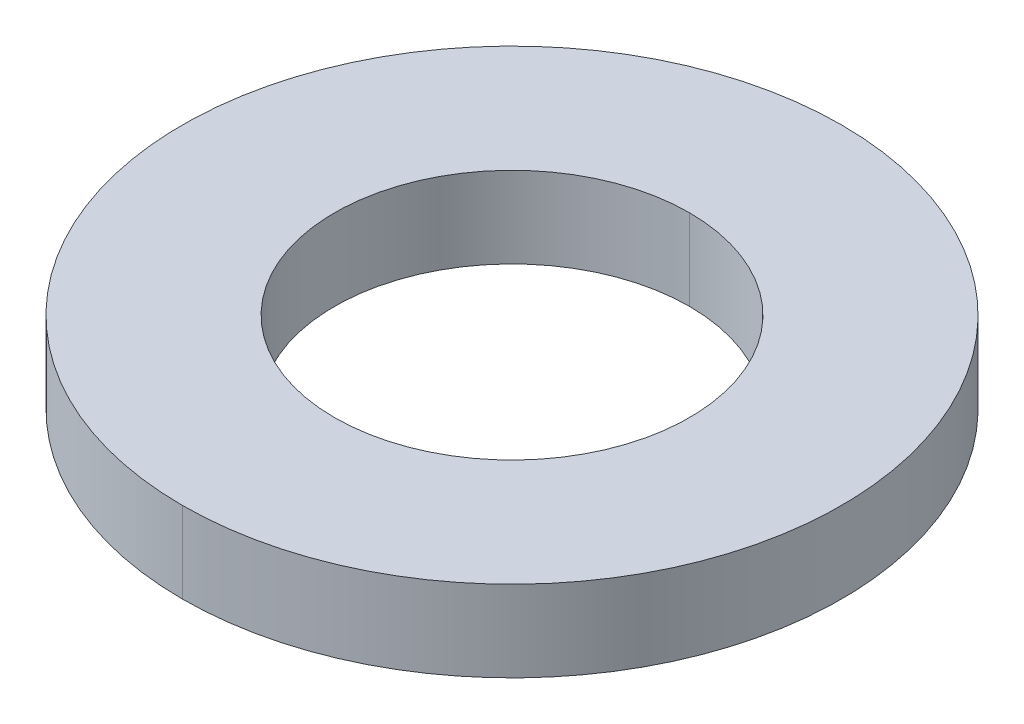
ISO-10303-21;
HEADER;
FILE_DESCRIPTION(('STEP AP214'),'2;1');
FILE_NAME('part.step','',(''),(''),'','','');
FILE_SCHEMA(('AUTOMOTIVE_DESIGN { 1 0 10303 214 1 1 1 1 }'));
ENDSEC;
DATA;
#1=APPLICATION_CONTEXT('core data for automotive mechanical design processes');
#2=APPLICATION_PROTOCOL_DEFINITION('international standard','automotive_design',2000,#1);
#3=PRODUCT_CONTEXT('',#1,'mechanical');
#4=PRODUCT('Part','Part','',(#3));
#5=PRODUCT_RELATED_PRODUCT_CATEGORY('part','',(#4));
#6=PRODUCT_DEFINITION_FORMATION('','',#4);
#7=PRODUCT_DEFINITION_CONTEXT('part definition',#1,'design');
#8=PRODUCT_DEFINITION('design','',#6,#7);
#9=PRODUCT_DEFINITION_SHAPE('','',#8);
#10=(LENGTH_UNIT() NAMED_UNIT(*) SI_UNIT(.MILLI.,.METRE.));
#11=(NAMED_UNIT(*) PLANE_ANGLE_UNIT() SI_UNIT($,.RADIAN.));
#12=(NAMED_UNIT(*) SI_UNIT($,.STERADIAN.) SOLID_ANGLE_UNIT());
#13=UNCERTAINTY_MEASURE_WITH_UNIT(LENGTH_MEASURE(1.E-05),#10,'distance_accuracy_value','');
#14=(GEOMETRIC_REPRESENTATION_CONTEXT(3) GLOBAL_UNCERTAINTY_ASSIGNED_CONTEXT((#13)) GLOBAL_UNIT_ASSIGNED_CONTEXT((#10,
#11,#12)) REPRESENTATION_CONTEXT('',''));
#15=CARTESIAN_POINT('',(0.,0.,0.));
#16=DIRECTION('',(0.,0.,1.));
#17=DIRECTION('',(1.,0.,0.));
#18=AXIS2_PLACEMENT_3D('',#15,#16,#17);
#19=CARTESIAN_POINT('',(0.,0.8,0.));
#20=DIRECTION('',(0.,-1.,0.));
#21=DIRECTION('',(0.,0.,-1.));
#22=AXIS2_PLACEMENT_3D('',#19,#20,#21);
#23=CYLINDRICAL_SURFACE('',#22,1.75);
#24=DIRECTION('',(0.,-1.,0.));
#25=VECTOR('',#24,1.);
#26=CARTESIAN_POINT('',(0.,0.8,1.75));
#27=LINE('',#26,#25);
#28=CARTESIAN_POINT('',(0.,0.8,1.75));
#29=VERTEX_POINT('',#28);
#30=CARTESIAN_POINT('',(0.,0.,1.75));
#31=VERTEX_POINT('',#30);
#32=EDGE_CURVE('E20',#29,#31,#27,.T.);
#33=ORIENTED_EDGE('',*,*,#32,.F.);
#34=CARTESIAN_POINT('',(0.,0.8,0.));
#35=DIRECTION('',(0.,1.,0.));
#36=DIRECTION('',(0.,0.,1.));
#37=AXIS2_PLACEMENT_3D('',#34,#35,#36);
#38=CIRCLE('',#37,1.75);
#39=CARTESIAN_POINT('',(0.,0.8,-1.75));
#40=VERTEX_POINT('',#39);
#41=EDGE_CURVE('E106',#29,#40,#38,.T.);
#42=ORIENTED_EDGE('',*,*,#41,.T.);
#43=DIRECTION('',(0.,-1.,0.));
#44=VECTOR('',#43,1.);
#45=CARTESIAN_POINT('',(0.,0.8,-1.75));
#46=LINE('',#45,#44);
#47=CARTESIAN_POINT('',(0.,0.,-1.75));
#48=VERTEX_POINT('',#47);
#49=EDGE_CURVE('E75',#40,#48,#46,.T.);
#50=ORIENTED_EDGE('',*,*,#49,.T.);
#51=CARTESIAN_POINT('',(0.,0.,0.));
#52=DIRECTION('',(0.,1.,0.));
#53=DIRECTION('',(0.,0.,1.));
#54=AXIS2_PLACEMENT_3D('',#51,#52,#53);
#55=CIRCLE('',#54,1.75);
#56=EDGE_CURVE('E11',#31,#48,#55,.T.);
#57=ORIENTED_EDGE('',*,*,#56,.F.);
#58=EDGE_LOOP('',(#33,#42,#50,#57));
#59=FACE_BOUND('',#58,.T.);
#60=ADVANCED_FACE('F16',(#59),#23,.F.);
#61=CARTESIAN_POINT('',(0.,0.8,0.));
#62=DIRECTION('',(0.,-1.,0.));
#63=DIRECTION('',(0.,0.,-1.));
#64=AXIS2_PLACEMENT_3D('',#61,#62,#63);
#65=CYLINDRICAL_SURFACE('',#64,3.25);
#66=DIRECTION('',(0.,-1.,0.));
#67=VECTOR('',#66,1.);
#68=CARTESIAN_POINT('',(0.,0.8,3.25));
#69=LINE('',#68,#67);
#70=CARTESIAN_POINT('',(0.,0.8,3.25));
#71=VERTEX_POINT('',#70);
#72=CARTESIAN_POINT('',(0.,0.,3.25));
#73=VERTEX_POINT('',#72);
#74=EDGE_CURVE('E109',#71,#73,#69,.T.);
#75=ORIENTED_EDGE('',*,*,#74,.F.);
#76=CARTESIAN_POINT('',(0.,0.8,0.));
#77=DIRECTION('',(0.,1.,0.));
#78=DIRECTION('',(0.,0.,1.));
#79=AXIS2_PLACEMENT_3D('',#76,#77,#78);
#80=CIRCLE('',#79,3.25);
#81=CARTESIAN_POINT('',(0.,0.8,-3.25));
#82=VERTEX_POINT('',#81);
#83=EDGE_CURVE('E98',#82,#71,#80,.T.);
#84=ORIENTED_EDGE('',*,*,#83,.F.);
#85=DIRECTION('',(0.,-1.,0.));
#86=VECTOR('',#85,1.);
#87=CARTESIAN_POINT('',(0.,0.8,-3.25));
#88=LINE('',#87,#86);
#89=CARTESIAN_POINT('',(0.,0.,-3.25));
#90=VERTEX_POINT('',#89);
#91=EDGE_CURVE('E97',#82,#90,#88,.T.);
#92=ORIENTED_EDGE('',*,*,#91,.T.);
#93=CARTESIAN_POINT('',(0.,0.,0.));
#94=DIRECTION('',(0.,1.,0.));
#95=DIRECTION('',(0.,0.,1.));
#96=AXIS2_PLACEMENT_3D('',#93,#94,#95);
#97=CIRCLE('',#96,3.25);
#98=EDGE_CURVE('E27',#90,#73,#97,.T.);
#99=ORIENTED_EDGE('',*,*,#98,.T.);
#100=EDGE_LOOP('',(#75,#84,#92,#99));
#101=FACE_BOUND('',#100,.T.);
#102=ADVANCED_FACE('F168',(#101),#65,.T.);
#103=CARTESIAN_POINT('',(0.,0.,0.));
#104=DIRECTION('',(0.,1.,0.));
#105=DIRECTION('',(1.,0.,0.));
#106=AXIS2_PLACEMENT_3D('',#103,#104,#105);
#107=PLANE('',#106);
#108=CARTESIAN_POINT('',(0.,0.,0.));
#109=DIRECTION('',(0.,1.,0.));
#110=DIRECTION('',(0.,0.,1.));
#111=AXIS2_PLACEMENT_3D('',#108,#109,#110);
#112=CIRCLE('',#111,1.75);
#113=EDGE_CURVE('E77',#48,#31,#112,.T.);
#114=ORIENTED_EDGE('',*,*,#113,.T.);
#115=ORIENTED_EDGE('',*,*,#56,.T.);
#116=EDGE_LOOP('',(#114,#115));
#117=FACE_BOUND('',#116,.T.);
#118=ORIENTED_EDGE('',*,*,#98,.F.);
#119=CARTESIAN_POINT('',(0.,0.,0.));
#120=DIRECTION('',(0.,1.,0.));
#121=DIRECTION('',(0.,0.,1.));
#122=AXIS2_PLACEMENT_3D('',#119,#120,#121);
#123=CIRCLE('',#122,3.25);
#124=EDGE_CURVE('E99',#73,#90,#123,.T.);
#125=ORIENTED_EDGE('',*,*,#124,.F.);
#126=EDGE_LOOP('',(#118,#125));
#127=FACE_BOUND('',#126,.T.);
#128=ADVANCED_FACE('F78',(#117,#127),#107,.F.);
#129=CARTESIAN_POINT('',(0.,0.8,0.));
#130=DIRECTION('',(0.,1.,0.));
#131=DIRECTION('',(1.,0.,0.));
#132=AXIS2_PLACEMENT_3D('',#129,#130,#131);
#133=PLANE('',#132);
#134=CARTESIAN_POINT('',(0.,0.8,0.));
#135=DIRECTION('',(0.,1.,0.));
#136=DIRECTION('',(0.,0.,1.));
#137=AXIS2_PLACEMENT_3D('',#134,#135,#136);
#138=CIRCLE('',#137,1.75);
#139=EDGE_CURVE('E83',#40,#29,#138,.T.);
#140=ORIENTED_EDGE('',*,*,#139,.F.);
#141=ORIENTED_EDGE('',*,*,#41,.F.);
#142=EDGE_LOOP('',(#140,#141));
#143=FACE_BOUND('',#142,.T.);
#144=ORIENTED_EDGE('',*,*,#83,.T.);
#145=CARTESIAN_POINT('',(0.,0.8,0.));
#146=DIRECTION('',(0.,1.,0.));
#147=DIRECTION('',(0.,0.,1.));
#148=AXIS2_PLACEMENT_3D('',#145,#146,#147);
#149=CIRCLE('',#148,3.25);
#150=EDGE_CURVE('E116',#71,#82,#149,.T.);
#151=ORIENTED_EDGE('',*,*,#150,.T.);
#152=EDGE_LOOP('',(#144,#151));
#153=FACE_BOUND('',#152,.T.);
#154=ADVANCED_FACE('F18',(#143,#153),#133,.T.);
#155=CARTESIAN_POINT('',(0.,0.8,0.));
#156=DIRECTION('',(0.,-1.,0.));
#157=DIRECTION('',(0.,0.,-1.));
#158=AXIS2_PLACEMENT_3D('',#155,#156,#157);
#159=CYLINDRICAL_SURFACE('',#158,3.25);
#160=ORIENTED_EDGE('',*,*,#150,.F.);
#161=ORIENTED_EDGE('',*,*,#74,.T.);
#162=ORIENTED_EDGE('',*,*,#124,.T.);
#163=ORIENTED_EDGE('',*,*,#91,.F.);
#164=EDGE_LOOP('',(#160,#161,#162,#163));
#165=FACE_BOUND('',#164,.T.);
#166=ADVANCED_FACE('F157',(#165),#159,.T.);
#167=CARTESIAN_POINT('',(0.,0.8,0.));
#168=DIRECTION('',(0.,-1.,0.));
#169=DIRECTION('',(0.,0.,-1.));
#170=AXIS2_PLACEMENT_3D('',#167,#168,#169);
#171=CYLINDRICAL_SURFACE('',#170,1.75);
#172=ORIENTED_EDGE('',*,*,#139,.T.);
#173=ORIENTED_EDGE('',*,*,#32,.T.);
#174=ORIENTED_EDGE('',*,*,#113,.F.);
#175=ORIENTED_EDGE('',*,*,#49,.F.);
#176=EDGE_LOOP('',(#172,#173,#174,#175));
#177=FACE_BOUND('',#176,.T.);
#178=ADVANCED_FACE('F81',(#177),#171,.F.);
#179=CLOSED_SHELL('',(#60,#102,#128,#154,#166,#178));
#180=MANIFOLD_SOLID_BREP('B1',#179);
#181=ADVANCED_BREP_SHAPE_REPRESENTATION('',(#18,#180),#14);
#182=SHAPE_DEFINITION_REPRESENTATION(#9,#181);
ENDSEC;
END-ISO-10303-21;
